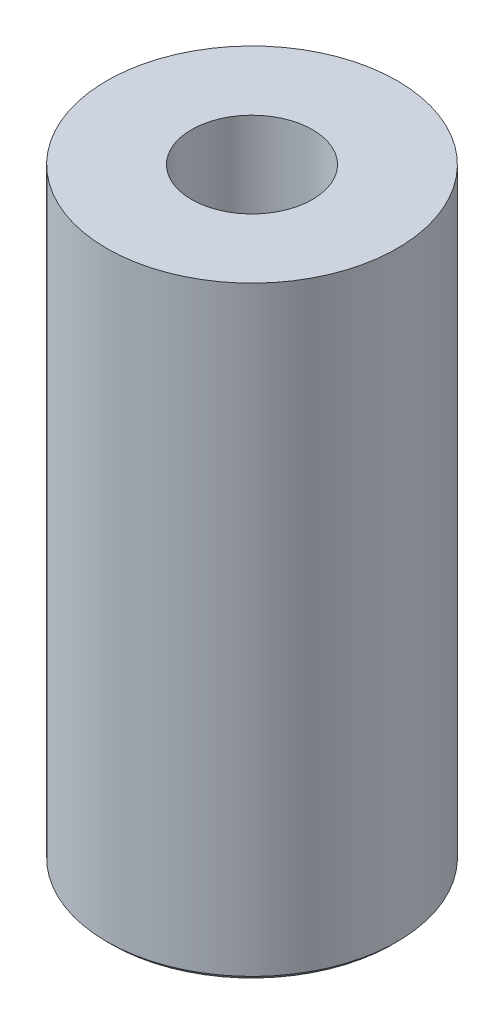
ISO-10303-21;
HEADER;
FILE_DESCRIPTION(('STEP AP214'),'2;1');
FILE_NAME('part.step','',(''),(''),'','','');
FILE_SCHEMA(('AUTOMOTIVE_DESIGN { 1 0 10303 214 1 1 1 1 }'));
ENDSEC;
DATA;
#1=APPLICATION_CONTEXT('core data for automotive mechanical design processes');
#2=APPLICATION_PROTOCOL_DEFINITION('international standard','automotive_design',2000,#1);
#3=PRODUCT_CONTEXT('',#1,'mechanical');
#4=PRODUCT('Part','Part','',(#3));
#5=PRODUCT_RELATED_PRODUCT_CATEGORY('part','',(#4));
#6=PRODUCT_DEFINITION_FORMATION('','',#4);
#7=PRODUCT_DEFINITION_CONTEXT('part definition',#1,'design');
#8=PRODUCT_DEFINITION('design','',#6,#7);
#9=PRODUCT_DEFINITION_SHAPE('','',#8);
#10=(LENGTH_UNIT() NAMED_UNIT(*) SI_UNIT(.MILLI.,.METRE.));
#11=(NAMED_UNIT(*) PLANE_ANGLE_UNIT() SI_UNIT($,.RADIAN.));
#12=(NAMED_UNIT(*) SI_UNIT($,.STERADIAN.) SOLID_ANGLE_UNIT());
#13=UNCERTAINTY_MEASURE_WITH_UNIT(LENGTH_MEASURE(1.E-05),#10,'distance_accuracy_value','');
#14=(GEOMETRIC_REPRESENTATION_CONTEXT(3) GLOBAL_UNCERTAINTY_ASSIGNED_CONTEXT((#13)) GLOBAL_UNIT_ASSIGNED_CONTEXT((#10,
#11,#12)) REPRESENTATION_CONTEXT('',''));
#15=CARTESIAN_POINT('',(0.,0.,0.));
#16=DIRECTION('',(0.,0.,1.));
#17=DIRECTION('',(1.,0.,0.));
#18=AXIS2_PLACEMENT_3D('',#15,#16,#17);
#19=CARTESIAN_POINT('',(0.,25.,0.));
#20=DIRECTION('',(0.,-1.,0.));
#21=DIRECTION('',(0.,0.,-1.));
#22=AXIS2_PLACEMENT_3D('',#19,#20,#21);
#23=CYLINDRICAL_SURFACE('',#22,6.);
#24=CARTESIAN_POINT('',(0.,0.199999999999995,0.));
#25=DIRECTION('',(0.,1.,0.));
#26=DIRECTION('',(0.,0.,1.));
#27=AXIS2_PLACEMENT_3D('',#24,#25,#26);
#28=CIRCLE('',#27,6.);
#29=CARTESIAN_POINT('',(0.,0.199999999999995,6.));
#30=VERTEX_POINT('',#29);
#31=EDGE_CURVE('E57',#30,#30,#28,.T.);
#32=ORIENTED_EDGE('',*,*,#31,.T.);
#33=EDGE_LOOP('',(#32));
#34=FACE_BOUND('',#33,.T.);
#35=CARTESIAN_POINT('',(0.,25.,0.));
#36=DIRECTION('',(0.,1.,0.));
#37=DIRECTION('',(0.,0.,1.));
#38=AXIS2_PLACEMENT_3D('',#35,#36,#37);
#39=CIRCLE('',#38,6.);
#40=CARTESIAN_POINT('',(0.,25.,6.));
#41=VERTEX_POINT('',#40);
#42=EDGE_CURVE('E70',#41,#41,#39,.T.);
#43=ORIENTED_EDGE('',*,*,#42,.F.);
#44=EDGE_LOOP('',(#43));
#45=FACE_BOUND('',#44,.T.);
#46=ADVANCED_FACE('F49',(#34,#45),#23,.T.);
#47=CARTESIAN_POINT('',(0.,25.,0.));
#48=DIRECTION('',(0.,1.,0.));
#49=DIRECTION('',(0.,0.,1.));
#50=AXIS2_PLACEMENT_3D('',#47,#48,#49);
#51=PLANE('',#50);
#52=CARTESIAN_POINT('',(0.,25.,0.));
#53=DIRECTION('',(0.,1.,0.));
#54=DIRECTION('',(0.,0.,1.));
#55=AXIS2_PLACEMENT_3D('',#52,#53,#54);
#56=CIRCLE('',#55,2.49999999999999);
#57=CARTESIAN_POINT('',(0.,25.,2.49999999999999));
#58=VERTEX_POINT('',#57);
#59=EDGE_CURVE('E71',#58,#58,#56,.T.);
#60=ORIENTED_EDGE('',*,*,#59,.F.);
#61=EDGE_LOOP('',(#60));
#62=FACE_BOUND('',#61,.T.);
#63=ORIENTED_EDGE('',*,*,#42,.T.);
#64=EDGE_LOOP('',(#63));
#65=FACE_BOUND('',#64,.T.);
#66=ADVANCED_FACE('F91',(#62,#65),#51,.T.);
#67=CARTESIAN_POINT('',(0.,0.,0.));
#68=DIRECTION('',(0.,1.,0.));
#69=DIRECTION('',(0.,0.,1.));
#70=AXIS2_PLACEMENT_3D('',#67,#68,#69);
#71=PLANE('',#70);
#72=CARTESIAN_POINT('',(0.,0.,0.));
#73=DIRECTION('',(0.,1.,0.));
#74=DIRECTION('',(0.,0.,1.));
#75=AXIS2_PLACEMENT_3D('',#72,#73,#74);
#76=CIRCLE('',#75,5.8);
#77=CARTESIAN_POINT('',(0.,0.,5.8));
#78=VERTEX_POINT('',#77);
#79=EDGE_CURVE('E11',#78,#78,#76,.F.);
#80=ORIENTED_EDGE('',*,*,#79,.T.);
#81=EDGE_LOOP('',(#80));
#82=FACE_BOUND('',#81,.T.);
#83=ADVANCED_FACE('F64',(#82),#71,.F.);
#84=CARTESIAN_POINT('',(0.,19.,0.));
#85=DIRECTION('',(0.,1.,0.));
#86=DIRECTION('',(0.,0.,1.));
#87=AXIS2_PLACEMENT_3D('',#84,#85,#86);
#88=CONICAL_SURFACE('',#87,2.5,1.02974425867665);
#89=CARTESIAN_POINT('',(0.,17.4978484524311,0.));
#90=VERTEX_POINT('',#89);
#91=VERTEX_LOOP('',#90);
#92=FACE_BOUND('',#91,.T.);
#93=CARTESIAN_POINT('',(0.,19.,0.));
#94=DIRECTION('',(0.,1.,0.));
#95=DIRECTION('',(0.,0.,1.));
#96=AXIS2_PLACEMENT_3D('',#93,#94,#95);
#97=CIRCLE('',#96,2.5);
#98=CARTESIAN_POINT('',(0.,19.,2.5));
#99=VERTEX_POINT('',#98);
#100=EDGE_CURVE('E68',#99,#99,#97,.T.);
#101=ORIENTED_EDGE('',*,*,#100,.T.);
#102=EDGE_LOOP('',(#101));
#103=FACE_BOUND('',#102,.T.);
#104=ADVANCED_FACE('F60',(#92,#103),#88,.F.);
#105=CARTESIAN_POINT('',(0.,25.,0.));
#106=DIRECTION('',(0.,1.,0.));
#107=DIRECTION('',(0.,0.,1.));
#108=AXIS2_PLACEMENT_3D('',#105,#106,#107);
#109=CYLINDRICAL_SURFACE('',#108,2.49999999999999);
#110=ORIENTED_EDGE('',*,*,#100,.F.);
#111=EDGE_LOOP('',(#110));
#112=FACE_BOUND('',#111,.T.);
#113=ORIENTED_EDGE('',*,*,#59,.T.);
#114=EDGE_LOOP('',(#113));
#115=FACE_BOUND('',#114,.T.);
#116=ADVANCED_FACE('F63',(#112,#115),#109,.F.);
#117=CARTESIAN_POINT('',(0.,0.199999999999995,0.));
#118=DIRECTION('',(0.,1.,0.));
#119=DIRECTION('',(0.,0.,1.));
#120=AXIS2_PLACEMENT_3D('',#117,#118,#119);
#121=CONICAL_SURFACE('',#120,6.,0.785398163397453);
#122=ORIENTED_EDGE('',*,*,#79,.F.);
#123=EDGE_LOOP('',(#122));
#124=FACE_BOUND('',#123,.T.);
#125=ORIENTED_EDGE('',*,*,#31,.F.);
#126=EDGE_LOOP('',(#125));
#127=FACE_BOUND('',#126,.T.);
#128=ADVANCED_FACE('F52',(#124,#127),#121,.T.);
#129=CLOSED_SHELL('',(#46,#66,#83,#104,#116,#128));
#130=MANIFOLD_SOLID_BREP('B2',#129);
#131=ADVANCED_BREP_SHAPE_REPRESENTATION('',(#18,#130),#14);
#132=SHAPE_DEFINITION_REPRESENTATION(#9,#131);
ENDSEC;
END-ISO-10303-21;
